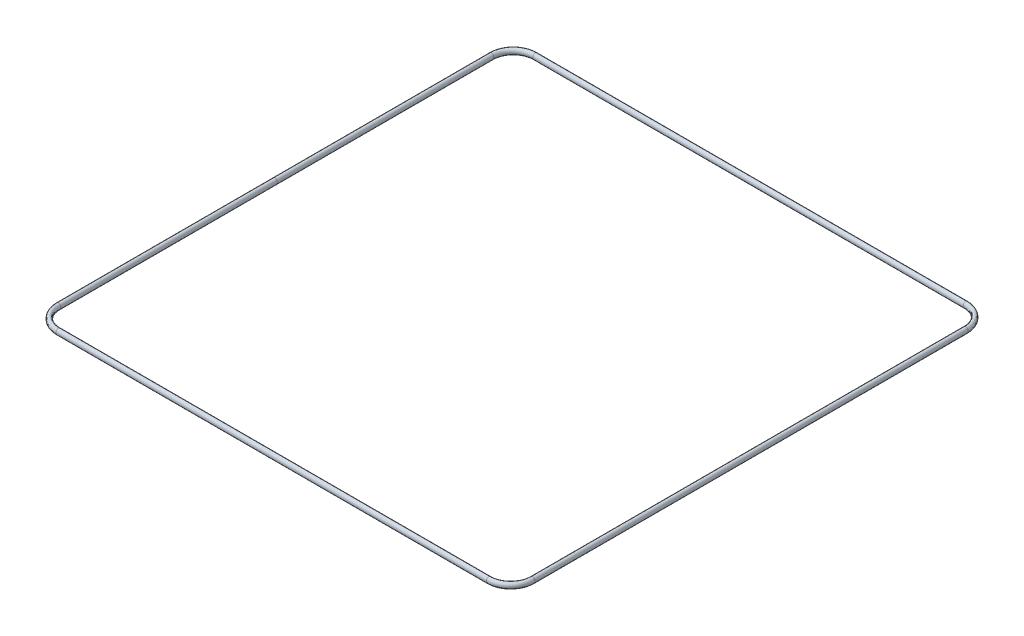
ISO-10303-21;
HEADER;
FILE_DESCRIPTION(('STEP AP214'),'2;1');
FILE_NAME('part.step','',(''),(''),'','','');
FILE_SCHEMA(('AUTOMOTIVE_DESIGN { 1 0 10303 214 1 1 1 1 }'));
ENDSEC;
DATA;
#1=APPLICATION_CONTEXT('core data for automotive mechanical design processes');
#2=APPLICATION_PROTOCOL_DEFINITION('international standard','automotive_design',2000,#1);
#3=PRODUCT_CONTEXT('',#1,'mechanical');
#4=PRODUCT('Part','Part','',(#3));
#5=PRODUCT_RELATED_PRODUCT_CATEGORY('part','',(#4));
#6=PRODUCT_DEFINITION_FORMATION('','',#4);
#7=PRODUCT_DEFINITION_CONTEXT('part definition',#1,'design');
#8=PRODUCT_DEFINITION('design','',#6,#7);
#9=PRODUCT_DEFINITION_SHAPE('','',#8);
#10=(LENGTH_UNIT() NAMED_UNIT(*) SI_UNIT(.MILLI.,.METRE.));
#11=(NAMED_UNIT(*) PLANE_ANGLE_UNIT() SI_UNIT($,.RADIAN.));
#12=(NAMED_UNIT(*) SI_UNIT($,.STERADIAN.) SOLID_ANGLE_UNIT());
#13=UNCERTAINTY_MEASURE_WITH_UNIT(LENGTH_MEASURE(1.E-05),#10,'distance_accuracy_value','');
#14=(GEOMETRIC_REPRESENTATION_CONTEXT(3) GLOBAL_UNCERTAINTY_ASSIGNED_CONTEXT((#13)) GLOBAL_UNIT_ASSIGNED_CONTEXT((#10,
#11,#12)) REPRESENTATION_CONTEXT('',''));
#15=CARTESIAN_POINT('',(0.,0.,0.));
#16=DIRECTION('',(0.,0.,1.));
#17=DIRECTION('',(1.,0.,0.));
#18=AXIS2_PLACEMENT_3D('',#15,#16,#17);
#19=CARTESIAN_POINT('',(-140.335,1.78,0.));
#20=CARTESIAN_POINT('',(-140.335,1.78,-128.143));
#21=CARTESIAN_POINT('',(-143.129,1.77999999999991,0.));
#22=CARTESIAN_POINT('',(-143.129,1.77999999999991,-128.143));
#23=CARTESIAN_POINT('',(-143.129,-1.78000000000009,0.));
#24=CARTESIAN_POINT('',(-143.129,-1.78000000000009,-128.143));
#25=CARTESIAN_POINT('',(-140.335,-1.78,0.));
#26=CARTESIAN_POINT('',(-140.335,-1.78,-128.143));
#27=CARTESIAN_POINT('',(-137.541,-1.77999999999991,0.));
#28=CARTESIAN_POINT('',(-137.541,-1.77999999999991,-128.143));
#29=CARTESIAN_POINT('',(-137.541,1.78000000000009,0.));
#30=CARTESIAN_POINT('',(-137.541,1.78000000000009,-128.143));
#31=CARTESIAN_POINT('',(-140.335,1.78,0.));
#32=CARTESIAN_POINT('',(-140.335,1.78,-128.143));
#33=(BOUNDED_SURFACE() B_SPLINE_SURFACE(3,1,((#19,#20),(#21,#22),(#23,#24),(#25,#26),(#27,#28),
(#29,#30),(#31,#32)),.UNSPECIFIED.,.T.,.F.,.F.) B_SPLINE_SURFACE_WITH_KNOTS((4,3,4),(2,2),(0.,
0.5,1.),(0.,1.),.UNSPECIFIED.) GEOMETRIC_REPRESENTATION_ITEM() RATIONAL_B_SPLINE_SURFACE(((1.,
1.),(0.333333333333333,0.333333333333333),(0.333333333333333,0.333333333333333),(1.,1.),
(0.333333333333333,0.333333333333333),(0.333333333333333,0.333333333333333),(1.,1.))) REPRESENTATION_ITEM('') SURFACE());
#34=CARTESIAN_POINT('',(-140.335,0.,-128.143));
#35=DIRECTION('',(0.,0.,1.));
#36=DIRECTION('',(0.,1.,0.));
#37=AXIS2_PLACEMENT_3D('',#34,#35,#36);
#38=ELLIPSE('',#37,1.78,1.39700000000009);
#39=CARTESIAN_POINT('',(-140.335,1.78,-128.143));
#40=VERTEX_POINT('',#39);
#41=EDGE_CURVE('E84',#40,#40,#38,.T.);
#42=CARTESIAN_POINT('',(-140.335,0.,0.));
#43=DIRECTION('',(0.,0.,1.));
#44=DIRECTION('',(0.,1.,0.));
#45=AXIS2_PLACEMENT_3D('',#42,#43,#44);
#46=ELLIPSE('',#45,1.78,1.39700000000009);
#47=CARTESIAN_POINT('',(-140.335,1.78,0.));
#48=VERTEX_POINT('',#47);
#49=EDGE_CURVE('E88',#48,#48,#46,.T.);
#50=ORIENTED_EDGE('',*,*,#41,.T.);
#51=EDGE_LOOP('',(#50));
#52=FACE_BOUND('',#51,.T.);
#53=ORIENTED_EDGE('',*,*,#49,.F.);
#54=EDGE_LOOP('',(#53));
#55=FACE_BOUND('',#54,.T.);
#56=ADVANCED_FACE('F46',(#52,#55),#33,.F.);
#57=CARTESIAN_POINT('',(-140.335,1.78,-128.143));
#58=CARTESIAN_POINT('',(-140.335,1.78,-135.731277513019));
#59=CARTESIAN_POINT('',(-134.969277513019,1.78,-141.097));
#60=CARTESIAN_POINT('',(-127.381,1.78,-141.097));
#61=CARTESIAN_POINT('',(-143.129,1.77999999999991,-128.143));
#62=CARTESIAN_POINT('',(-143.129,1.77999999999991,-137.367964819749));
#63=CARTESIAN_POINT('',(-136.605964819749,1.77999999999991,-143.891));
#64=CARTESIAN_POINT('',(-127.381,1.77999999999991,-143.891));
#65=CARTESIAN_POINT('',(-143.129,-1.78000000000009,-128.143));
#66=CARTESIAN_POINT('',(-143.129,-1.78000000000009,-137.367964819749));
#67=CARTESIAN_POINT('',(-136.605964819749,-1.78000000000009,-143.891));
#68=CARTESIAN_POINT('',(-127.381,-1.78000000000009,-143.891));
#69=CARTESIAN_POINT('',(-140.335,-1.78,-128.143));
#70=CARTESIAN_POINT('',(-140.335,-1.78,-135.731277513019));
#71=CARTESIAN_POINT('',(-134.969277513019,-1.78,-141.097));
#72=CARTESIAN_POINT('',(-127.381,-1.78,-141.097));
#73=CARTESIAN_POINT('',(-137.541,-1.77999999999991,-128.143));
#74=CARTESIAN_POINT('',(-137.541,-1.77999999999991,-134.094590206289));
#75=CARTESIAN_POINT('',(-133.332590206289,-1.77999999999991,-138.303));
#76=CARTESIAN_POINT('',(-127.381,-1.77999999999991,-138.303));
#77=CARTESIAN_POINT('',(-137.541,1.78000000000009,-128.143));
#78=CARTESIAN_POINT('',(-137.541,1.78000000000009,-134.094590206289));
#79=CARTESIAN_POINT('',(-133.332590206289,1.78000000000009,-138.303));
#80=CARTESIAN_POINT('',(-127.381,1.78000000000009,-138.303));
#81=CARTESIAN_POINT('',(-140.335,1.78,-128.143));
#82=CARTESIAN_POINT('',(-140.335,1.78,-135.731277513019));
#83=CARTESIAN_POINT('',(-134.969277513019,1.78,-141.097));
#84=CARTESIAN_POINT('',(-127.381,1.78,-141.097));
#85=(BOUNDED_SURFACE() B_SPLINE_SURFACE(3,3,((#57,#58,#59,#60),(#61,#62,#63,#64),(#65,#66,#67,
#68),(#69,#70,#71,#72),(#73,#74,#75,#76),(#77,#78,#79,#80),(#81,#82,#83,#84)),.UNSPECIFIED.,.T.,
.F.,.F.) B_SPLINE_SURFACE_WITH_KNOTS((4,3,4),(4,4),(0.,0.5,1.),(0.,1.),
.UNSPECIFIED.) GEOMETRIC_REPRESENTATION_ITEM() RATIONAL_B_SPLINE_SURFACE(((1.,0.804737854124365,
0.804737854124365,1.),(0.333333333333333,0.268245951374788,0.268245951374788,0.333333333333333),
(0.333333333333333,0.268245951374788,0.268245951374788,0.333333333333333),(1.,0.804737854124365,
0.804737854124365,1.),(0.333333333333333,0.268245951374788,0.268245951374788,0.333333333333333),
(0.333333333333333,0.268245951374788,0.268245951374788,0.333333333333333),(1.,0.804737854124365,
0.804737854124365,1.))) REPRESENTATION_ITEM('') SURFACE());
#86=CARTESIAN_POINT('',(-127.381,0.,-141.097));
#87=DIRECTION('',(-1.,0.,0.));
#88=DIRECTION('',(0.,1.,0.));
#89=AXIS2_PLACEMENT_3D('',#86,#87,#88);
#90=ELLIPSE('',#89,1.78,1.39700000000009);
#91=CARTESIAN_POINT('',(-127.381,1.78,-141.097));
#92=VERTEX_POINT('',#91);
#93=EDGE_CURVE('E80',#92,#92,#90,.T.);
#94=ORIENTED_EDGE('',*,*,#93,.T.);
#95=EDGE_LOOP('',(#94));
#96=FACE_BOUND('',#95,.T.);
#97=ORIENTED_EDGE('',*,*,#41,.F.);
#98=EDGE_LOOP('',(#97));
#99=FACE_BOUND('',#98,.T.);
#100=ADVANCED_FACE('F96',(#96,#99),#85,.F.);
#101=CARTESIAN_POINT('',(-127.381,1.78,-141.097));
#102=CARTESIAN_POINT('',(127.381,1.78,-141.097));
#103=CARTESIAN_POINT('',(-127.381,1.77999999999991,-143.891));
#104=CARTESIAN_POINT('',(127.381,1.77999999999991,-143.891));
#105=CARTESIAN_POINT('',(-127.381,-1.78000000000009,-143.891));
#106=CARTESIAN_POINT('',(127.381,-1.78000000000009,-143.891));
#107=CARTESIAN_POINT('',(-127.381,-1.78,-141.097));
#108=CARTESIAN_POINT('',(127.381,-1.78,-141.097));
#109=CARTESIAN_POINT('',(-127.381,-1.77999999999991,-138.303));
#110=CARTESIAN_POINT('',(127.381,-1.77999999999991,-138.303));
#111=CARTESIAN_POINT('',(-127.381,1.78000000000009,-138.303));
#112=CARTESIAN_POINT('',(127.381,1.78000000000009,-138.303));
#113=CARTESIAN_POINT('',(-127.381,1.78,-141.097));
#114=CARTESIAN_POINT('',(127.381,1.78,-141.097));
#115=(BOUNDED_SURFACE() B_SPLINE_SURFACE(3,1,((#101,#102),(#103,#104),(#105,#106),(#107,#108),
(#109,#110),(#111,#112),(#113,#114)),.UNSPECIFIED.,.T.,.F.,.F.) B_SPLINE_SURFACE_WITH_KNOTS((4,
3,4),(2,2),(0.,0.5,1.),(0.,1.),
.UNSPECIFIED.) GEOMETRIC_REPRESENTATION_ITEM() RATIONAL_B_SPLINE_SURFACE(((1.,1.),
(0.333333333333333,0.333333333333333),(0.333333333333333,0.333333333333333),(1.,1.),
(0.333333333333333,0.333333333333333),(0.333333333333333,0.333333333333333),(1.,1.))) REPRESENTATION_ITEM('') SURFACE());
#116=CARTESIAN_POINT('',(127.381,0.,-141.097));
#117=DIRECTION('',(-1.,0.,0.));
#118=DIRECTION('',(0.,1.,0.));
#119=AXIS2_PLACEMENT_3D('',#116,#117,#118);
#120=ELLIPSE('',#119,1.78,1.39700000000009);
#121=CARTESIAN_POINT('',(127.381,1.78,-141.097));
#122=VERTEX_POINT('',#121);
#123=EDGE_CURVE('E76',#122,#122,#120,.T.);
#124=ORIENTED_EDGE('',*,*,#123,.T.);
#125=EDGE_LOOP('',(#124));
#126=FACE_BOUND('',#125,.T.);
#127=ORIENTED_EDGE('',*,*,#93,.F.);
#128=EDGE_LOOP('',(#127));
#129=FACE_BOUND('',#128,.T.);
#130=ADVANCED_FACE('F102',(#126,#129),#115,.F.);
#131=CARTESIAN_POINT('',(127.381,1.78,-141.097));
#132=CARTESIAN_POINT('',(134.969277513019,1.78,-141.097));
#133=CARTESIAN_POINT('',(140.335,1.78,-135.731277513019));
#134=CARTESIAN_POINT('',(140.335,1.78,-128.143));
#135=CARTESIAN_POINT('',(127.381,1.77999999999991,-143.891));
#136=CARTESIAN_POINT('',(136.605964819749,1.77999999999991,-143.891));
#137=CARTESIAN_POINT('',(143.129,1.77999999999991,-137.367964819749));
#138=CARTESIAN_POINT('',(143.129,1.77999999999991,-128.143));
#139=CARTESIAN_POINT('',(127.381,-1.78000000000009,-143.891));
#140=CARTESIAN_POINT('',(136.605964819749,-1.78000000000009,-143.891));
#141=CARTESIAN_POINT('',(143.129,-1.78000000000009,-137.367964819749));
#142=CARTESIAN_POINT('',(143.129,-1.78000000000009,-128.143));
#143=CARTESIAN_POINT('',(127.381,-1.78,-141.097));
#144=CARTESIAN_POINT('',(134.969277513019,-1.78,-141.097));
#145=CARTESIAN_POINT('',(140.335,-1.78,-135.731277513019));
#146=CARTESIAN_POINT('',(140.335,-1.78,-128.143));
#147=CARTESIAN_POINT('',(127.381,-1.77999999999991,-138.303));
#148=CARTESIAN_POINT('',(133.332590206289,-1.77999999999991,-138.303));
#149=CARTESIAN_POINT('',(137.541,-1.77999999999991,-134.094590206289));
#150=CARTESIAN_POINT('',(137.541,-1.77999999999991,-128.143));
#151=CARTESIAN_POINT('',(127.381,1.78000000000009,-138.303));
#152=CARTESIAN_POINT('',(133.332590206289,1.78000000000009,-138.303));
#153=CARTESIAN_POINT('',(137.541,1.78000000000009,-134.094590206289));
#154=CARTESIAN_POINT('',(137.541,1.78000000000009,-128.143));
#155=CARTESIAN_POINT('',(127.381,1.78,-141.097));
#156=CARTESIAN_POINT('',(134.969277513019,1.78,-141.097));
#157=CARTESIAN_POINT('',(140.335,1.78,-135.731277513019));
#158=CARTESIAN_POINT('',(140.335,1.78,-128.143));
#159=(BOUNDED_SURFACE() B_SPLINE_SURFACE(3,3,((#131,#132,#133,#134),(#135,#136,#137,#138),(#139,
#140,#141,#142),(#143,#144,#145,#146),(#147,#148,#149,#150),(#151,#152,#153,#154),(#155,#156,
#157,#158)),.UNSPECIFIED.,.T.,.F.,.F.) B_SPLINE_SURFACE_WITH_KNOTS((4,3,4),(4,4),(0.,0.5,1.),
(0.,1.),.UNSPECIFIED.) GEOMETRIC_REPRESENTATION_ITEM() RATIONAL_B_SPLINE_SURFACE(((1.,
0.804737854124365,0.804737854124365,1.),(0.333333333333333,0.268245951374788,0.268245951374788,
0.333333333333333),(0.333333333333333,0.268245951374788,0.268245951374788,0.333333333333333),
(1.,0.804737854124365,0.804737854124365,1.),(0.333333333333333,0.268245951374788,
0.268245951374788,0.333333333333333),(0.333333333333333,0.268245951374788,0.268245951374788,
0.333333333333333),(1.,0.804737854124365,0.804737854124365,1.))) REPRESENTATION_ITEM('') SURFACE());
#160=CARTESIAN_POINT('',(140.335,0.,-128.143));
#161=DIRECTION('',(0.,0.,-1.));
#162=DIRECTION('',(0.,1.,0.));
#163=AXIS2_PLACEMENT_3D('',#160,#161,#162);
#164=ELLIPSE('',#163,1.78,1.39700000000009);
#165=CARTESIAN_POINT('',(140.335,1.78,-128.143));
#166=VERTEX_POINT('',#165);
#167=EDGE_CURVE('E72',#166,#166,#164,.T.);
#168=ORIENTED_EDGE('',*,*,#167,.T.);
#169=EDGE_LOOP('',(#168));
#170=FACE_BOUND('',#169,.T.);
#171=ORIENTED_EDGE('',*,*,#123,.F.);
#172=EDGE_LOOP('',(#171));
#173=FACE_BOUND('',#172,.T.);
#174=ADVANCED_FACE('F124',(#170,#173),#159,.F.);
#175=CARTESIAN_POINT('',(140.335,1.78,-128.143));
#176=CARTESIAN_POINT('',(140.335,1.78,128.143));
#177=CARTESIAN_POINT('',(143.129,1.77999999999991,-128.143));
#178=CARTESIAN_POINT('',(143.129,1.77999999999991,128.143));
#179=CARTESIAN_POINT('',(143.129,-1.78000000000009,-128.143));
#180=CARTESIAN_POINT('',(143.129,-1.78000000000009,128.143));
#181=CARTESIAN_POINT('',(140.335,-1.78,-128.143));
#182=CARTESIAN_POINT('',(140.335,-1.78,128.143));
#183=CARTESIAN_POINT('',(137.541,-1.77999999999991,-128.143));
#184=CARTESIAN_POINT('',(137.541,-1.77999999999991,128.143));
#185=CARTESIAN_POINT('',(137.541,1.78000000000009,-128.143));
#186=CARTESIAN_POINT('',(137.541,1.78000000000009,128.143));
#187=CARTESIAN_POINT('',(140.335,1.78,-128.143));
#188=CARTESIAN_POINT('',(140.335,1.78,128.143));
#189=(BOUNDED_SURFACE() B_SPLINE_SURFACE(3,1,((#175,#176),(#177,#178),(#179,#180),(#181,#182),
(#183,#184),(#185,#186),(#187,#188)),.UNSPECIFIED.,.T.,.F.,.F.) B_SPLINE_SURFACE_WITH_KNOTS((4,
3,4),(2,2),(0.,0.5,1.),(0.,1.),
.UNSPECIFIED.) GEOMETRIC_REPRESENTATION_ITEM() RATIONAL_B_SPLINE_SURFACE(((1.,1.),
(0.333333333333333,0.333333333333333),(0.333333333333333,0.333333333333333),(1.,1.),
(0.333333333333333,0.333333333333333),(0.333333333333333,0.333333333333333),(1.,1.))) REPRESENTATION_ITEM('') SURFACE());
#190=CARTESIAN_POINT('',(140.335,0.,128.143));
#191=DIRECTION('',(0.,0.,-1.));
#192=DIRECTION('',(0.,1.,0.));
#193=AXIS2_PLACEMENT_3D('',#190,#191,#192);
#194=ELLIPSE('',#193,1.78,1.39700000000009);
#195=CARTESIAN_POINT('',(140.335,1.78,128.143));
#196=VERTEX_POINT('',#195);
#197=EDGE_CURVE('E66',#196,#196,#194,.T.);
#198=ORIENTED_EDGE('',*,*,#197,.T.);
#199=EDGE_LOOP('',(#198));
#200=FACE_BOUND('',#199,.T.);
#201=ORIENTED_EDGE('',*,*,#167,.F.);
#202=EDGE_LOOP('',(#201));
#203=FACE_BOUND('',#202,.T.);
#204=ADVANCED_FACE('F135',(#200,#203),#189,.F.);
#205=CARTESIAN_POINT('',(140.335,1.78,128.143));
#206=CARTESIAN_POINT('',(140.335,1.78,135.731277513019));
#207=CARTESIAN_POINT('',(134.969277513019,1.78,141.097));
#208=CARTESIAN_POINT('',(127.381,1.78,141.097));
#209=CARTESIAN_POINT('',(143.129,1.77999999999991,128.143));
#210=CARTESIAN_POINT('',(143.129,1.77999999999991,137.367964819749));
#211=CARTESIAN_POINT('',(136.605964819749,1.77999999999991,143.891));
#212=CARTESIAN_POINT('',(127.381,1.77999999999991,143.891));
#213=CARTESIAN_POINT('',(143.129,-1.78000000000009,128.143));
#214=CARTESIAN_POINT('',(143.129,-1.78000000000009,137.367964819749));
#215=CARTESIAN_POINT('',(136.605964819749,-1.78000000000009,143.891));
#216=CARTESIAN_POINT('',(127.381,-1.78000000000009,143.891));
#217=CARTESIAN_POINT('',(140.335,-1.78,128.143));
#218=CARTESIAN_POINT('',(140.335,-1.78,135.731277513019));
#219=CARTESIAN_POINT('',(134.969277513019,-1.78,141.097));
#220=CARTESIAN_POINT('',(127.381,-1.78,141.097));
#221=CARTESIAN_POINT('',(137.541,-1.77999999999991,128.143));
#222=CARTESIAN_POINT('',(137.541,-1.77999999999991,134.094590206289));
#223=CARTESIAN_POINT('',(133.332590206289,-1.77999999999991,138.303));
#224=CARTESIAN_POINT('',(127.381,-1.77999999999991,138.303));
#225=CARTESIAN_POINT('',(137.541,1.78000000000009,128.143));
#226=CARTESIAN_POINT('',(137.541,1.78000000000009,134.094590206289));
#227=CARTESIAN_POINT('',(133.332590206289,1.78000000000009,138.303));
#228=CARTESIAN_POINT('',(127.381,1.78000000000009,138.303));
#229=CARTESIAN_POINT('',(140.335,1.78,128.143));
#230=CARTESIAN_POINT('',(140.335,1.78,135.731277513019));
#231=CARTESIAN_POINT('',(134.969277513019,1.78,141.097));
#232=CARTESIAN_POINT('',(127.381,1.78,141.097));
#233=(BOUNDED_SURFACE() B_SPLINE_SURFACE(3,3,((#205,#206,#207,#208),(#209,#210,#211,#212),(#213,
#214,#215,#216),(#217,#218,#219,#220),(#221,#222,#223,#224),(#225,#226,#227,#228),(#229,#230,
#231,#232)),.UNSPECIFIED.,.T.,.F.,.F.) B_SPLINE_SURFACE_WITH_KNOTS((4,3,4),(4,4),(0.,0.5,1.),
(0.,1.),.UNSPECIFIED.) GEOMETRIC_REPRESENTATION_ITEM() RATIONAL_B_SPLINE_SURFACE(((1.,
0.804737854124365,0.804737854124365,1.),(0.333333333333333,0.268245951374788,0.268245951374788,
0.333333333333333),(0.333333333333333,0.268245951374788,0.268245951374788,0.333333333333333),
(1.,0.804737854124365,0.804737854124365,1.),(0.333333333333333,0.268245951374788,
0.268245951374788,0.333333333333333),(0.333333333333333,0.268245951374788,0.268245951374788,
0.333333333333333),(1.,0.804737854124365,0.804737854124365,1.))) REPRESENTATION_ITEM('') SURFACE());
#234=CARTESIAN_POINT('',(127.381,0.,141.097));
#235=DIRECTION('',(1.,0.,0.));
#236=DIRECTION('',(0.,1.,0.));
#237=AXIS2_PLACEMENT_3D('',#234,#235,#236);
#238=ELLIPSE('',#237,1.78,1.39700000000009);
#239=CARTESIAN_POINT('',(127.381,1.78,141.097));
#240=VERTEX_POINT('',#239);
#241=EDGE_CURVE('E61',#240,#240,#238,.T.);
#242=ORIENTED_EDGE('',*,*,#241,.T.);
#243=EDGE_LOOP('',(#242));
#244=FACE_BOUND('',#243,.T.);
#245=ORIENTED_EDGE('',*,*,#197,.F.);
#246=EDGE_LOOP('',(#245));
#247=FACE_BOUND('',#246,.T.);
#248=ADVANCED_FACE('F146',(#244,#247),#233,.F.);
#249=CARTESIAN_POINT('',(127.381,1.78,141.097));
#250=CARTESIAN_POINT('',(-127.381,1.78,141.097));
#251=CARTESIAN_POINT('',(127.381,1.77999999999991,143.891));
#252=CARTESIAN_POINT('',(-127.381,1.77999999999991,143.891));
#253=CARTESIAN_POINT('',(127.381,-1.78000000000009,143.891));
#254=CARTESIAN_POINT('',(-127.381,-1.78000000000009,143.891));
#255=CARTESIAN_POINT('',(127.381,-1.78,141.097));
#256=CARTESIAN_POINT('',(-127.381,-1.78,141.097));
#257=CARTESIAN_POINT('',(127.381,-1.77999999999991,138.303));
#258=CARTESIAN_POINT('',(-127.381,-1.77999999999991,138.303));
#259=CARTESIAN_POINT('',(127.381,1.78000000000009,138.303));
#260=CARTESIAN_POINT('',(-127.381,1.78000000000009,138.303));
#261=CARTESIAN_POINT('',(127.381,1.78,141.097));
#262=CARTESIAN_POINT('',(-127.381,1.78,141.097));
#263=(BOUNDED_SURFACE() B_SPLINE_SURFACE(3,1,((#249,#250),(#251,#252),(#253,#254),(#255,#256),
(#257,#258),(#259,#260),(#261,#262)),.UNSPECIFIED.,.T.,.F.,.F.) B_SPLINE_SURFACE_WITH_KNOTS((4,
3,4),(2,2),(0.,0.5,1.),(0.,1.),
.UNSPECIFIED.) GEOMETRIC_REPRESENTATION_ITEM() RATIONAL_B_SPLINE_SURFACE(((1.,1.),
(0.333333333333333,0.333333333333333),(0.333333333333333,0.333333333333333),(1.,1.),
(0.333333333333333,0.333333333333333),(0.333333333333333,0.333333333333333),(1.,1.))) REPRESENTATION_ITEM('') SURFACE());
#264=CARTESIAN_POINT('',(-127.381,0.,141.097));
#265=DIRECTION('',(1.,0.,0.));
#266=DIRECTION('',(0.,1.,0.));
#267=AXIS2_PLACEMENT_3D('',#264,#265,#266);
#268=ELLIPSE('',#267,1.78,1.39700000000009);
#269=CARTESIAN_POINT('',(-127.381,1.78,141.097));
#270=VERTEX_POINT('',#269);
#271=EDGE_CURVE('E56',#270,#270,#268,.T.);
#272=ORIENTED_EDGE('',*,*,#271,.T.);
#273=EDGE_LOOP('',(#272));
#274=FACE_BOUND('',#273,.T.);
#275=ORIENTED_EDGE('',*,*,#241,.F.);
#276=EDGE_LOOP('',(#275));
#277=FACE_BOUND('',#276,.T.);
#278=ADVANCED_FACE('F157',(#274,#277),#263,.F.);
#279=CARTESIAN_POINT('',(-127.381,1.78,141.097));
#280=CARTESIAN_POINT('',(-134.969277513019,1.78,141.097));
#281=CARTESIAN_POINT('',(-140.335,1.78,135.731277513019));
#282=CARTESIAN_POINT('',(-140.335,1.78,128.143));
#283=CARTESIAN_POINT('',(-127.381,1.77999999999991,143.891));
#284=CARTESIAN_POINT('',(-136.605964819749,1.77999999999991,143.891));
#285=CARTESIAN_POINT('',(-143.129,1.77999999999991,137.367964819749));
#286=CARTESIAN_POINT('',(-143.129,1.77999999999991,128.143));
#287=CARTESIAN_POINT('',(-127.381,-1.78000000000009,143.891));
#288=CARTESIAN_POINT('',(-136.605964819749,-1.78000000000009,143.891));
#289=CARTESIAN_POINT('',(-143.129,-1.78000000000009,137.367964819749));
#290=CARTESIAN_POINT('',(-143.129,-1.78000000000009,128.143));
#291=CARTESIAN_POINT('',(-127.381,-1.78,141.097));
#292=CARTESIAN_POINT('',(-134.969277513019,-1.78,141.097));
#293=CARTESIAN_POINT('',(-140.335,-1.78,135.731277513019));
#294=CARTESIAN_POINT('',(-140.335,-1.78,128.143));
#295=CARTESIAN_POINT('',(-127.381,-1.77999999999991,138.303));
#296=CARTESIAN_POINT('',(-133.332590206289,-1.77999999999991,138.303));
#297=CARTESIAN_POINT('',(-137.541,-1.77999999999991,134.094590206289));
#298=CARTESIAN_POINT('',(-137.541,-1.77999999999991,128.143));
#299=CARTESIAN_POINT('',(-127.381,1.78000000000009,138.303));
#300=CARTESIAN_POINT('',(-133.332590206289,1.78000000000009,138.303));
#301=CARTESIAN_POINT('',(-137.541,1.78000000000009,134.094590206289));
#302=CARTESIAN_POINT('',(-137.541,1.78000000000009,128.143));
#303=CARTESIAN_POINT('',(-127.381,1.78,141.097));
#304=CARTESIAN_POINT('',(-134.969277513019,1.78,141.097));
#305=CARTESIAN_POINT('',(-140.335,1.78,135.731277513019));
#306=CARTESIAN_POINT('',(-140.335,1.78,128.143));
#307=(BOUNDED_SURFACE() B_SPLINE_SURFACE(3,3,((#279,#280,#281,#282),(#283,#284,#285,#286),(#287,
#288,#289,#290),(#291,#292,#293,#294),(#295,#296,#297,#298),(#299,#300,#301,#302),(#303,#304,
#305,#306)),.UNSPECIFIED.,.T.,.F.,.F.) B_SPLINE_SURFACE_WITH_KNOTS((4,3,4),(4,4),(0.,0.5,1.),
(0.,1.),.UNSPECIFIED.) GEOMETRIC_REPRESENTATION_ITEM() RATIONAL_B_SPLINE_SURFACE(((1.,
0.804737854124365,0.804737854124365,1.),(0.333333333333333,0.268245951374788,0.268245951374788,
0.333333333333333),(0.333333333333333,0.268245951374788,0.268245951374788,0.333333333333333),
(1.,0.804737854124365,0.804737854124365,1.),(0.333333333333333,0.268245951374788,
0.268245951374788,0.333333333333333),(0.333333333333333,0.268245951374788,0.268245951374788,
0.333333333333333),(1.,0.804737854124365,0.804737854124365,1.))) REPRESENTATION_ITEM('') SURFACE());
#308=CARTESIAN_POINT('',(-140.335,0.,128.143));
#309=DIRECTION('',(0.,0.,1.));
#310=DIRECTION('',(0.,1.,0.));
#311=AXIS2_PLACEMENT_3D('',#308,#309,#310);
#312=ELLIPSE('',#311,1.78,1.39700000000009);
#313=CARTESIAN_POINT('',(-140.335,1.78,128.143));
#314=VERTEX_POINT('',#313);
#315=EDGE_CURVE('E10',#314,#314,#312,.T.);
#316=ORIENTED_EDGE('',*,*,#315,.T.);
#317=EDGE_LOOP('',(#316));
#318=FACE_BOUND('',#317,.T.);
#319=ORIENTED_EDGE('',*,*,#271,.F.);
#320=EDGE_LOOP('',(#319));
#321=FACE_BOUND('',#320,.T.);
#322=ADVANCED_FACE('F167',(#318,#321),#307,.F.);
#323=CARTESIAN_POINT('',(-140.335,1.78,128.143));
#324=CARTESIAN_POINT('',(-140.335,1.78,0.));
#325=CARTESIAN_POINT('',(-143.129,1.77999999999991,128.143));
#326=CARTESIAN_POINT('',(-143.129,1.77999999999991,0.));
#327=CARTESIAN_POINT('',(-143.129,-1.78000000000009,128.143));
#328=CARTESIAN_POINT('',(-143.129,-1.78000000000009,0.));
#329=CARTESIAN_POINT('',(-140.335,-1.78,128.143));
#330=CARTESIAN_POINT('',(-140.335,-1.78,0.));
#331=CARTESIAN_POINT('',(-137.541,-1.77999999999991,128.143));
#332=CARTESIAN_POINT('',(-137.541,-1.77999999999991,0.));
#333=CARTESIAN_POINT('',(-137.541,1.78000000000009,128.143));
#334=CARTESIAN_POINT('',(-137.541,1.78000000000009,0.));
#335=CARTESIAN_POINT('',(-140.335,1.78,128.143));
#336=CARTESIAN_POINT('',(-140.335,1.78,0.));
#337=(BOUNDED_SURFACE() B_SPLINE_SURFACE(3,1,((#323,#324),(#325,#326),(#327,#328),(#329,#330),
(#331,#332),(#333,#334),(#335,#336)),.UNSPECIFIED.,.T.,.F.,.F.) B_SPLINE_SURFACE_WITH_KNOTS((4,
3,4),(2,2),(0.,0.5,1.),(0.,1.),
.UNSPECIFIED.) GEOMETRIC_REPRESENTATION_ITEM() RATIONAL_B_SPLINE_SURFACE(((1.,1.),
(0.333333333333333,0.333333333333333),(0.333333333333333,0.333333333333333),(1.,1.),
(0.333333333333333,0.333333333333333),(0.333333333333333,0.333333333333333),(1.,1.))) REPRESENTATION_ITEM('') SURFACE());
#338=ORIENTED_EDGE('',*,*,#49,.T.);
#339=EDGE_LOOP('',(#338));
#340=FACE_BOUND('',#339,.T.);
#341=ORIENTED_EDGE('',*,*,#315,.F.);
#342=EDGE_LOOP('',(#341));
#343=FACE_BOUND('',#342,.T.);
#344=ADVANCED_FACE('F48',(#340,#343),#337,.F.);
#345=CLOSED_SHELL('',(#56,#100,#130,#174,#204,#248,#278,#322,#344));
#346=MANIFOLD_SOLID_BREP('B2',#345);
#347=ADVANCED_BREP_SHAPE_REPRESENTATION('',(#18,#346),#14);
#348=SHAPE_DEFINITION_REPRESENTATION(#9,#347);
ENDSEC;
END-ISO-10303-21;
